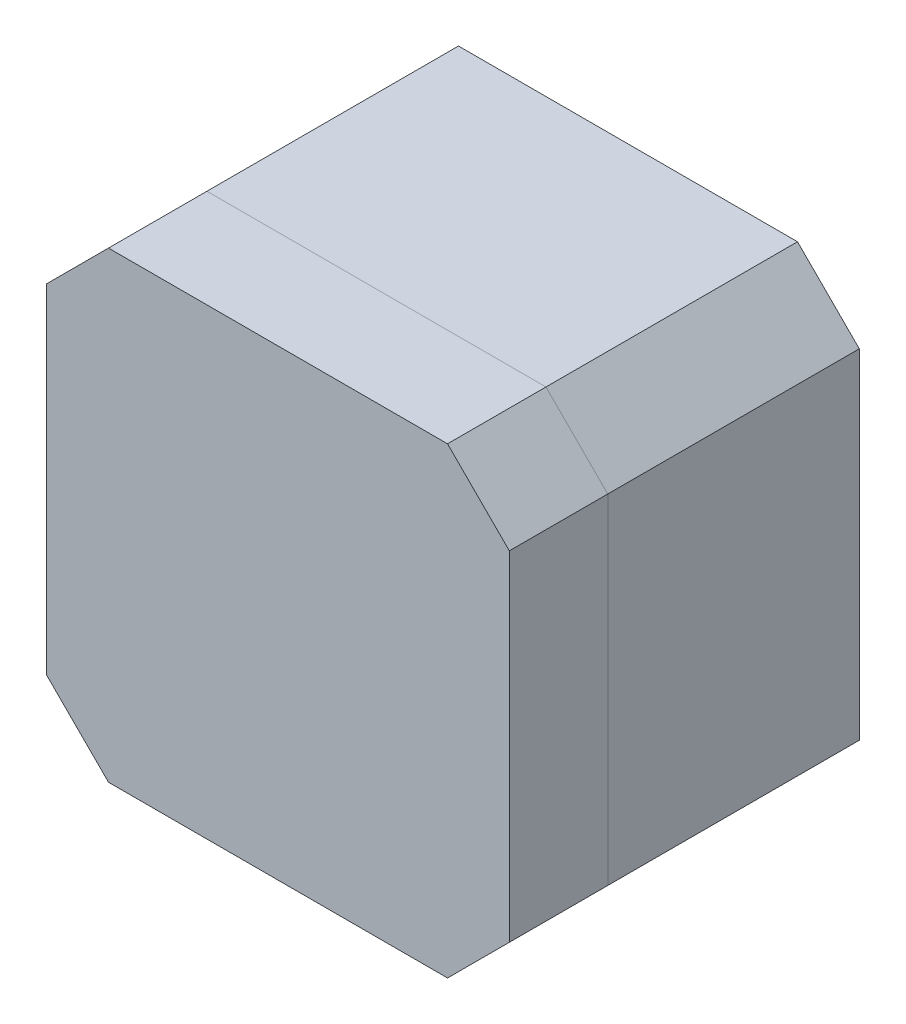
ISO-10303-21;
HEADER;
FILE_DESCRIPTION(('STEP AP214'),'2;1');
FILE_NAME('part.step','',(''),(''),'','','');
FILE_SCHEMA(('AUTOMOTIVE_DESIGN { 1 0 10303 214 1 1 1 1 }'));
ENDSEC;
DATA;
#1=APPLICATION_CONTEXT('core data for automotive mechanical design processes');
#2=APPLICATION_PROTOCOL_DEFINITION('international standard','automotive_design',2000,#1);
#3=PRODUCT_CONTEXT('',#1,'mechanical');
#4=PRODUCT('Part','Part','',(#3));
#5=PRODUCT_RELATED_PRODUCT_CATEGORY('part','',(#4));
#6=PRODUCT_DEFINITION_FORMATION('','',#4);
#7=PRODUCT_DEFINITION_CONTEXT('part definition',#1,'design');
#8=PRODUCT_DEFINITION('design','',#6,#7);
#9=PRODUCT_DEFINITION_SHAPE('','',#8);
#10=(LENGTH_UNIT() NAMED_UNIT(*) SI_UNIT(.MILLI.,.METRE.));
#11=(NAMED_UNIT(*) PLANE_ANGLE_UNIT() SI_UNIT($,.RADIAN.));
#12=(NAMED_UNIT(*) SI_UNIT($,.STERADIAN.) SOLID_ANGLE_UNIT());
#13=UNCERTAINTY_MEASURE_WITH_UNIT(LENGTH_MEASURE(1.E-05),#10,'distance_accuracy_value','');
#14=(GEOMETRIC_REPRESENTATION_CONTEXT(3) GLOBAL_UNCERTAINTY_ASSIGNED_CONTEXT((#13)) GLOBAL_UNIT_ASSIGNED_CONTEXT((#10,
#11,#12)) REPRESENTATION_CONTEXT('',''));
#15=CARTESIAN_POINT('',(0.,0.,0.));
#16=DIRECTION('',(0.,0.,1.));
#17=DIRECTION('',(1.,0.,0.));
#18=AXIS2_PLACEMENT_3D('',#15,#16,#17);
#19=CARTESIAN_POINT('',(-28.5136216956462,-42.5764234913279,57.));
#20=DIRECTION('',(0.,0.,1.));
#21=DIRECTION('',(1.,0.,0.));
#22=AXIS2_PLACEMENT_3D('',#19,#20,#21);
#23=PLANE('',#22);
#24=DIRECTION('',(0.707106781186549,-0.707106781186547,0.));
#25=VECTOR('',#24,1.);
#26=CARTESIAN_POINT('',(-44.0136216956461,-63.7264234913279,57.));
#27=LINE('',#26,#25);
#28=CARTESIAN_POINT('',(-49.6636216956461,-58.0764234913279,57.));
#29=VERTEX_POINT('',#28);
#30=CARTESIAN_POINT('',(-44.0136216956461,-63.7264234913279,57.));
#31=VERTEX_POINT('',#30);
#32=EDGE_CURVE('P0_E10',#29,#31,#27,.T.);
#33=ORIENTED_EDGE('',*,*,#32,.T.);
#34=DIRECTION('',(1.,0.,0.));
#35=VECTOR('',#34,1.);
#36=CARTESIAN_POINT('',(-13.0136216956461,-63.7264234913279,57.));
#37=LINE('',#36,#35);
#38=CARTESIAN_POINT('',(-13.0136216956461,-63.7264234913279,57.));
#39=VERTEX_POINT('',#38);
#40=EDGE_CURVE('P0_E141',#31,#39,#37,.T.);
#41=ORIENTED_EDGE('',*,*,#40,.T.);
#42=DIRECTION('',(0.707106781186546,0.707106781186549,0.));
#43=VECTOR('',#42,1.);
#44=CARTESIAN_POINT('',(-7.36362169564612,-58.0764234913279,57.));
#45=LINE('',#44,#43);
#46=CARTESIAN_POINT('',(-7.36362169564612,-58.0764234913279,57.));
#47=VERTEX_POINT('',#46);
#48=EDGE_CURVE('P0_E55',#39,#47,#45,.T.);
#49=ORIENTED_EDGE('',*,*,#48,.T.);
#50=DIRECTION('',(0.,1.,0.));
#51=VECTOR('',#50,1.);
#52=CARTESIAN_POINT('',(-7.36362169564617,-27.0764234913279,57.));
#53=LINE('',#52,#51);
#54=CARTESIAN_POINT('',(-7.36362169564617,-27.0764234913279,57.));
#55=VERTEX_POINT('',#54);
#56=EDGE_CURVE('P0_E128',#47,#55,#53,.T.);
#57=ORIENTED_EDGE('',*,*,#56,.T.);
#58=DIRECTION('',(-0.707106781186552,0.707106781186543,0.));
#59=VECTOR('',#58,1.);
#60=CARTESIAN_POINT('',(-13.0136216956462,-21.4264234913279,57.));
#61=LINE('',#60,#59);
#62=CARTESIAN_POINT('',(-13.0136216956462,-21.4264234913279,57.));
#63=VERTEX_POINT('',#62);
#64=EDGE_CURVE('P0_E97',#55,#63,#61,.T.);
#65=ORIENTED_EDGE('',*,*,#64,.T.);
#66=DIRECTION('',(-1.,0.,0.));
#67=VECTOR('',#66,1.);
#68=CARTESIAN_POINT('',(-44.0136216956462,-21.426423491328,57.));
#69=LINE('',#68,#67);
#70=CARTESIAN_POINT('',(-44.0136216956462,-21.426423491328,57.));
#71=VERTEX_POINT('',#70);
#72=EDGE_CURVE('P0_E79',#63,#71,#69,.T.);
#73=ORIENTED_EDGE('',*,*,#72,.T.);
#74=DIRECTION('',(-0.707106781186549,-0.707106781186547,0.));
#75=VECTOR('',#74,1.);
#76=CARTESIAN_POINT('',(-49.6636216956462,-27.0764234913279,57.));
#77=LINE('',#76,#75);
#78=CARTESIAN_POINT('',(-49.6636216956462,-27.0764234913279,57.));
#79=VERTEX_POINT('',#78);
#80=EDGE_CURVE('P0_E118',#71,#79,#77,.T.);
#81=ORIENTED_EDGE('',*,*,#80,.T.);
#82=DIRECTION('',(0.,-1.,0.));
#83=VECTOR('',#82,1.);
#84=CARTESIAN_POINT('',(-49.6636216956461,-58.0764234913279,57.));
#85=LINE('',#84,#83);
#86=EDGE_CURVE('P0_E159',#79,#29,#85,.T.);
#87=ORIENTED_EDGE('',*,*,#86,.T.);
#88=EDGE_LOOP('',(#33,#41,#49,#57,#65,#73,#81,#87));
#89=FACE_BOUND('',#88,.T.);
#90=ADVANCED_FACE('P0_F16',(#89),#23,.T.);
#91=CARTESIAN_POINT('',(-28.5136216956462,-42.5764234913279,48.));
#92=DIRECTION('',(0.,0.,1.));
#93=DIRECTION('',(1.,0.,0.));
#94=AXIS2_PLACEMENT_3D('',#91,#92,#93);
#95=PLANE('',#94);
#96=DIRECTION('',(-0.707106781186549,0.707106781186547,0.));
#97=VECTOR('',#96,1.);
#98=CARTESIAN_POINT('',(-44.0136216956462,-63.7264234913279,48.));
#99=LINE('',#98,#97);
#100=CARTESIAN_POINT('',(-44.0136216956462,-63.7264234913279,48.));
#101=VERTEX_POINT('',#100);
#102=CARTESIAN_POINT('',(-49.6636216956461,-58.0764234913279,48.));
#103=VERTEX_POINT('',#102);
#104=EDGE_CURVE('P0_E24',#101,#103,#99,.T.);
#105=ORIENTED_EDGE('',*,*,#104,.T.);
#106=DIRECTION('',(0.,1.,0.));
#107=VECTOR('',#106,1.);
#108=CARTESIAN_POINT('',(-49.6636216956461,-58.0764234913279,48.));
#109=LINE('',#108,#107);
#110=CARTESIAN_POINT('',(-49.6636216956462,-27.0764234913279,48.));
#111=VERTEX_POINT('',#110);
#112=EDGE_CURVE('P0_E151',#103,#111,#109,.T.);
#113=ORIENTED_EDGE('',*,*,#112,.T.);
#114=DIRECTION('',(0.707106781186549,0.707106781186547,0.));
#115=VECTOR('',#114,1.);
#116=CARTESIAN_POINT('',(-49.6636216956462,-27.0764234913279,48.));
#117=LINE('',#116,#115);
#118=CARTESIAN_POINT('',(-44.0136216956462,-21.426423491328,48.));
#119=VERTEX_POINT('',#118);
#120=EDGE_CURVE('P0_E109',#111,#119,#117,.T.);
#121=ORIENTED_EDGE('',*,*,#120,.T.);
#122=DIRECTION('',(1.,0.,0.));
#123=VECTOR('',#122,1.);
#124=CARTESIAN_POINT('',(-44.0136216956462,-21.426423491328,48.));
#125=LINE('',#124,#123);
#126=CARTESIAN_POINT('',(-13.0136216956462,-21.4264234913279,48.));
#127=VERTEX_POINT('',#126);
#128=EDGE_CURVE('P0_E101',#119,#127,#125,.T.);
#129=ORIENTED_EDGE('',*,*,#128,.T.);
#130=DIRECTION('',(0.707106781186552,-0.707106781186543,0.));
#131=VECTOR('',#130,1.);
#132=CARTESIAN_POINT('',(-13.0136216956462,-21.4264234913279,48.));
#133=LINE('',#132,#131);
#134=CARTESIAN_POINT('',(-7.36362169564617,-27.0764234913279,48.));
#135=VERTEX_POINT('',#134);
#136=EDGE_CURVE('P0_E86',#127,#135,#133,.T.);
#137=ORIENTED_EDGE('',*,*,#136,.T.);
#138=DIRECTION('',(0.,-1.,0.));
#139=VECTOR('',#138,1.);
#140=CARTESIAN_POINT('',(-7.36362169564617,-27.0764234913279,48.));
#141=LINE('',#140,#139);
#142=CARTESIAN_POINT('',(-7.36362169564612,-58.0764234913279,48.));
#143=VERTEX_POINT('',#142);
#144=EDGE_CURVE('P0_E124',#135,#143,#141,.T.);
#145=ORIENTED_EDGE('',*,*,#144,.T.);
#146=DIRECTION('',(-0.707106781186546,-0.707106781186549,0.));
#147=VECTOR('',#146,1.);
#148=CARTESIAN_POINT('',(-7.36362169564612,-58.0764234913279,48.));
#149=LINE('',#148,#147);
#150=CARTESIAN_POINT('',(-13.0136216956461,-63.7264234913279,48.));
#151=VERTEX_POINT('',#150);
#152=EDGE_CURVE('P0_E64',#143,#151,#149,.T.);
#153=ORIENTED_EDGE('',*,*,#152,.T.);
#154=DIRECTION('',(-1.,0.,0.));
#155=VECTOR('',#154,1.);
#156=CARTESIAN_POINT('',(-13.0136216956461,-63.7264234913279,48.));
#157=LINE('',#156,#155);
#158=EDGE_CURVE('P0_E137',#151,#101,#157,.T.);
#159=ORIENTED_EDGE('',*,*,#158,.T.);
#160=EDGE_LOOP('',(#105,#113,#121,#129,#137,#145,#153,#159));
#161=FACE_BOUND('',#160,.T.);
#162=ADVANCED_FACE('P0_F106',(#161),#95,.F.);
#163=CARTESIAN_POINT('',(-49.6636216956461,-58.0764234913279,48.));
#164=DIRECTION('',(-0.707106781186547,-0.707106781186549,0.));
#165=DIRECTION('',(0.707106781186549,-0.707106781186547,0.));
#166=AXIS2_PLACEMENT_3D('',#163,#164,#165);
#167=PLANE('',#166);
#168=ORIENTED_EDGE('',*,*,#104,.F.);
#169=DIRECTION('',(0.,0.,1.));
#170=VECTOR('',#169,1.);
#171=CARTESIAN_POINT('',(-44.0136216956462,-63.7264234913279,48.));
#172=LINE('',#171,#170);
#173=EDGE_CURVE('P0_E144',#101,#31,#172,.T.);
#174=ORIENTED_EDGE('',*,*,#173,.T.);
#175=ORIENTED_EDGE('',*,*,#32,.F.);
#176=DIRECTION('',(0.,0.,1.));
#177=VECTOR('',#176,1.);
#178=CARTESIAN_POINT('',(-49.6636216956461,-58.0764234913279,48.));
#179=LINE('',#178,#177);
#180=EDGE_CURVE('P0_E154',#103,#29,#179,.T.);
#181=ORIENTED_EDGE('',*,*,#180,.F.);
#182=EDGE_LOOP('',(#168,#174,#175,#181));
#183=FACE_BOUND('',#182,.T.);
#184=ADVANCED_FACE('P0_F155',(#183),#167,.T.);
#185=CARTESIAN_POINT('',(-44.0136216956462,-63.7264234913279,48.));
#186=DIRECTION('',(0.,-1.,0.));
#187=DIRECTION('',(1.,0.,0.));
#188=AXIS2_PLACEMENT_3D('',#185,#186,#187);
#189=PLANE('',#188);
#190=ORIENTED_EDGE('',*,*,#158,.F.);
#191=DIRECTION('',(0.,0.,1.));
#192=VECTOR('',#191,1.);
#193=CARTESIAN_POINT('',(-13.0136216956461,-63.7264234913279,48.));
#194=LINE('',#193,#192);
#195=EDGE_CURVE('P0_E133',#151,#39,#194,.T.);
#196=ORIENTED_EDGE('',*,*,#195,.T.);
#197=ORIENTED_EDGE('',*,*,#40,.F.);
#198=ORIENTED_EDGE('',*,*,#173,.F.);
#199=EDGE_LOOP('',(#190,#196,#197,#198));
#200=FACE_BOUND('',#199,.T.);
#201=ADVANCED_FACE('P0_F200',(#200),#189,.T.);
#202=CARTESIAN_POINT('',(-13.0136216956461,-63.7264234913279,48.));
#203=DIRECTION('',(0.707106781186549,-0.707106781186546,0.));
#204=DIRECTION('',(0.707106781186546,0.707106781186549,0.));
#205=AXIS2_PLACEMENT_3D('',#202,#203,#204);
#206=PLANE('',#205);
#207=ORIENTED_EDGE('',*,*,#152,.F.);
#208=DIRECTION('',(0.,0.,1.));
#209=VECTOR('',#208,1.);
#210=CARTESIAN_POINT('',(-7.36362169564612,-58.0764234913279,48.));
#211=LINE('',#210,#209);
#212=EDGE_CURVE('P0_E125',#143,#47,#211,.T.);
#213=ORIENTED_EDGE('',*,*,#212,.T.);
#214=ORIENTED_EDGE('',*,*,#48,.F.);
#215=ORIENTED_EDGE('',*,*,#195,.F.);
#216=EDGE_LOOP('',(#207,#213,#214,#215));
#217=FACE_BOUND('',#216,.T.);
#218=ADVANCED_FACE('P0_F205',(#217),#206,.T.);
#219=CARTESIAN_POINT('',(-7.36362169564612,-58.0764234913279,48.));
#220=DIRECTION('',(1.,0.,0.));
#221=DIRECTION('',(0.,1.,0.));
#222=AXIS2_PLACEMENT_3D('',#219,#220,#221);
#223=PLANE('',#222);
#224=ORIENTED_EDGE('',*,*,#144,.F.);
#225=DIRECTION('',(0.,0.,1.));
#226=VECTOR('',#225,1.);
#227=CARTESIAN_POINT('',(-7.36362169564617,-27.0764234913279,48.));
#228=LINE('',#227,#226);
#229=EDGE_CURVE('P0_E92',#135,#55,#228,.T.);
#230=ORIENTED_EDGE('',*,*,#229,.T.);
#231=ORIENTED_EDGE('',*,*,#56,.F.);
#232=ORIENTED_EDGE('',*,*,#212,.F.);
#233=EDGE_LOOP('',(#224,#230,#231,#232));
#234=FACE_BOUND('',#233,.T.);
#235=ADVANCED_FACE('P0_F209',(#234),#223,.T.);
#236=CARTESIAN_POINT('',(-7.36362169564617,-27.0764234913279,48.));
#237=DIRECTION('',(0.707106781186543,0.707106781186552,0.));
#238=DIRECTION('',(-0.707106781186552,0.707106781186543,0.));
#239=AXIS2_PLACEMENT_3D('',#236,#237,#238);
#240=PLANE('',#239);
#241=ORIENTED_EDGE('',*,*,#136,.F.);
#242=DIRECTION('',(0.,0.,1.));
#243=VECTOR('',#242,1.);
#244=CARTESIAN_POINT('',(-13.0136216956462,-21.4264234913279,48.));
#245=LINE('',#244,#243);
#246=EDGE_CURVE('P0_E90',#127,#63,#245,.T.);
#247=ORIENTED_EDGE('',*,*,#246,.T.);
#248=ORIENTED_EDGE('',*,*,#64,.F.);
#249=ORIENTED_EDGE('',*,*,#229,.F.);
#250=EDGE_LOOP('',(#241,#247,#248,#249));
#251=FACE_BOUND('',#250,.T.);
#252=ADVANCED_FACE('P0_F88',(#251),#240,.T.);
#253=CARTESIAN_POINT('',(-13.0136216956462,-21.4264234913279,48.));
#254=DIRECTION('',(0.,1.,0.));
#255=DIRECTION('',(-1.,0.,0.));
#256=AXIS2_PLACEMENT_3D('',#253,#254,#255);
#257=PLANE('',#256);
#258=ORIENTED_EDGE('',*,*,#128,.F.);
#259=DIRECTION('',(0.,0.,1.));
#260=VECTOR('',#259,1.);
#261=CARTESIAN_POINT('',(-44.0136216956462,-21.426423491328,48.));
#262=LINE('',#261,#260);
#263=EDGE_CURVE('P0_E111',#119,#71,#262,.T.);
#264=ORIENTED_EDGE('',*,*,#263,.T.);
#265=ORIENTED_EDGE('',*,*,#72,.F.);
#266=ORIENTED_EDGE('',*,*,#246,.F.);
#267=EDGE_LOOP('',(#258,#264,#265,#266));
#268=FACE_BOUND('',#267,.T.);
#269=ADVANCED_FACE('P0_F100',(#268),#257,.T.);
#270=CARTESIAN_POINT('',(-44.0136216956462,-21.426423491328,48.));
#271=DIRECTION('',(-0.707106781186547,0.707106781186549,0.));
#272=DIRECTION('',(-0.707106781186549,-0.707106781186547,0.));
#273=AXIS2_PLACEMENT_3D('',#270,#271,#272);
#274=PLANE('',#273);
#275=ORIENTED_EDGE('',*,*,#120,.F.);
#276=DIRECTION('',(0.,0.,1.));
#277=VECTOR('',#276,1.);
#278=CARTESIAN_POINT('',(-49.6636216956462,-27.0764234913279,48.));
#279=LINE('',#278,#277);
#280=EDGE_CURVE('P0_E164',#111,#79,#279,.T.);
#281=ORIENTED_EDGE('',*,*,#280,.T.);
#282=ORIENTED_EDGE('',*,*,#80,.F.);
#283=ORIENTED_EDGE('',*,*,#263,.F.);
#284=EDGE_LOOP('',(#275,#281,#282,#283));
#285=FACE_BOUND('',#284,.T.);
#286=ADVANCED_FACE('P0_F183',(#285),#274,.T.);
#287=CARTESIAN_POINT('',(-49.6636216956462,-27.0764234913279,48.));
#288=DIRECTION('',(-1.,0.,0.));
#289=DIRECTION('',(0.,-1.,0.));
#290=AXIS2_PLACEMENT_3D('',#287,#288,#289);
#291=PLANE('',#290);
#292=ORIENTED_EDGE('',*,*,#112,.F.);
#293=ORIENTED_EDGE('',*,*,#180,.T.);
#294=ORIENTED_EDGE('',*,*,#86,.F.);
#295=ORIENTED_EDGE('',*,*,#280,.F.);
#296=EDGE_LOOP('',(#292,#293,#294,#295));
#297=FACE_BOUND('',#296,.T.);
#298=ADVANCED_FACE('P0_F162',(#297),#291,.T.);
#299=CLOSED_SHELL('',(#90,#162,#184,#201,#218,#235,#252,#269,#286,#298));
#300=MANIFOLD_SOLID_BREP('P0_B1',#299);
#301=CARTESIAN_POINT('',(-28.5136216956462,-42.5764234913279,25.));
#302=DIRECTION('',(0.,0.,-1.));
#303=DIRECTION('',(1.,0.,0.));
#304=AXIS2_PLACEMENT_3D('',#301,#302,#303);
#305=PLANE('',#304);
#306=DIRECTION('',(0.70710678118655,-0.707106781186545,0.));
#307=VECTOR('',#306,1.);
#308=CARTESIAN_POINT('',(-7.3636216956462,-27.0764234913279,25.));
#309=LINE('',#308,#307);
#310=CARTESIAN_POINT('',(-13.0136216956462,-21.4264234913279,25.));
#311=VERTEX_POINT('',#310);
#312=CARTESIAN_POINT('',(-7.3636216956462,-27.0764234913279,25.));
#313=VERTEX_POINT('',#312);
#314=EDGE_CURVE('P1_E10',#311,#313,#309,.T.);
#315=ORIENTED_EDGE('',*,*,#314,.T.);
#316=DIRECTION('',(0.,-1.,0.));
#317=VECTOR('',#316,1.);
#318=CARTESIAN_POINT('',(-7.36362169564615,-58.0764234913278,25.));
#319=LINE('',#318,#317);
#320=CARTESIAN_POINT('',(-7.36362169564615,-58.0764234913279,25.));
#321=VERTEX_POINT('',#320);
#322=EDGE_CURVE('P1_E83',#313,#321,#319,.T.);
#323=ORIENTED_EDGE('',*,*,#322,.T.);
#324=DIRECTION('',(-0.707106781186546,-0.707106781186549,0.));
#325=VECTOR('',#324,1.);
#326=CARTESIAN_POINT('',(-13.0136216956461,-63.7264234913279,25.));
#327=LINE('',#326,#325);
#328=CARTESIAN_POINT('',(-13.0136216956461,-63.7264234913279,25.));
#329=VERTEX_POINT('',#328);
#330=EDGE_CURVE('P1_E87',#321,#329,#327,.T.);
#331=ORIENTED_EDGE('',*,*,#330,.T.);
#332=DIRECTION('',(-1.,0.,0.));
#333=VECTOR('',#332,1.);
#334=CARTESIAN_POINT('',(-44.0136216956462,-63.7264234913279,25.));
#335=LINE('',#334,#333);
#336=CARTESIAN_POINT('',(-44.0136216956462,-63.7264234913279,25.));
#337=VERTEX_POINT('',#336);
#338=EDGE_CURVE('P1_E194',#329,#337,#335,.T.);
#339=ORIENTED_EDGE('',*,*,#338,.T.);
#340=DIRECTION('',(-0.707106781186549,0.707106781186546,0.));
#341=VECTOR('',#340,1.);
#342=CARTESIAN_POINT('',(-44.0136216956462,-63.7264234913279,25.));
#343=LINE('',#342,#341);
#344=CARTESIAN_POINT('',(-49.6636216956462,-58.0764234913279,25.));
#345=VERTEX_POINT('',#344);
#346=EDGE_CURVE('P1_E183',#337,#345,#343,.T.);
#347=ORIENTED_EDGE('',*,*,#346,.T.);
#348=DIRECTION('',(0.,1.,0.));
#349=VECTOR('',#348,1.);
#350=CARTESIAN_POINT('',(-49.6636216956462,-42.576423491328,25.));
#351=LINE('',#350,#349);
#352=CARTESIAN_POINT('',(-49.6636216956462,-27.0764234913279,25.));
#353=VERTEX_POINT('',#352);
#354=EDGE_CURVE('P1_E172',#345,#353,#351,.T.);
#355=ORIENTED_EDGE('',*,*,#354,.T.);
#356=DIRECTION('',(0.707106781186547,0.707106781186548,0.));
#357=VECTOR('',#356,1.);
#358=CARTESIAN_POINT('',(-49.6636216956462,-27.0764234913279,25.));
#359=LINE('',#358,#357);
#360=CARTESIAN_POINT('',(-44.0136216956462,-21.426423491328,25.));
#361=VERTEX_POINT('',#360);
#362=EDGE_CURVE('P1_E163',#353,#361,#359,.T.);
#363=ORIENTED_EDGE('',*,*,#362,.T.);
#364=DIRECTION('',(1.,0.,0.));
#365=VECTOR('',#364,1.);
#366=CARTESIAN_POINT('',(-13.0136216956462,-21.4264234913279,25.));
#367=LINE('',#366,#365);
#368=EDGE_CURVE('P1_E128',#361,#311,#367,.T.);
#369=ORIENTED_EDGE('',*,*,#368,.T.);
#370=EDGE_LOOP('',(#315,#323,#331,#339,#347,#355,#363,#369));
#371=FACE_BOUND('',#370,.T.);
#372=CARTESIAN_POINT('',(-44.0136216956462,-27.0764234913279,25.));
#373=DIRECTION('',(0.,0.,1.));
#374=DIRECTION('',(1.,0.,0.));
#375=AXIS2_PLACEMENT_3D('',#372,#373,#374);
#376=CIRCLE('',#375,1.5);
#377=CARTESIAN_POINT('',(-45.5136216956462,-27.0764234913279,25.));
#378=VERTEX_POINT('',#377);
#379=EDGE_CURVE('P1_E145',#378,#378,#376,.T.);
#380=ORIENTED_EDGE('',*,*,#379,.T.);
#381=EDGE_LOOP('',(#380));
#382=FACE_BOUND('',#381,.T.);
#383=CARTESIAN_POINT('',(-13.0136216956461,-58.0764234913279,25.));
#384=DIRECTION('',(0.,0.,1.));
#385=DIRECTION('',(1.,0.,0.));
#386=AXIS2_PLACEMENT_3D('',#383,#384,#385);
#387=CIRCLE('',#386,1.5);
#388=CARTESIAN_POINT('',(-14.5136216956461,-58.0764234913279,25.));
#389=VERTEX_POINT('',#388);
#390=EDGE_CURVE('P1_E139',#389,#389,#387,.T.);
#391=ORIENTED_EDGE('',*,*,#390,.T.);
#392=EDGE_LOOP('',(#391));
#393=FACE_BOUND('',#392,.T.);
#394=CARTESIAN_POINT('',(-44.0136216956462,-58.0764234913279,25.));
#395=DIRECTION('',(0.,0.,1.));
#396=DIRECTION('',(1.,0.,0.));
#397=AXIS2_PLACEMENT_3D('',#394,#395,#396);
#398=CIRCLE('',#397,1.5);
#399=CARTESIAN_POINT('',(-45.5136216956462,-58.0764234913279,25.));
#400=VERTEX_POINT('',#399);
#401=EDGE_CURVE('P1_E134',#400,#400,#398,.T.);
#402=ORIENTED_EDGE('',*,*,#401,.T.);
#403=EDGE_LOOP('',(#402));
#404=FACE_BOUND('',#403,.T.);
#405=CARTESIAN_POINT('',(-13.0136216956462,-27.0764234913279,25.));
#406=DIRECTION('',(0.,0.,1.));
#407=DIRECTION('',(1.,0.,0.));
#408=AXIS2_PLACEMENT_3D('',#405,#406,#407);
#409=CIRCLE('',#408,1.5);
#410=CARTESIAN_POINT('',(-14.5136216956462,-27.0764234913279,25.));
#411=VERTEX_POINT('',#410);
#412=EDGE_CURVE('P1_E135',#411,#411,#409,.T.);
#413=ORIENTED_EDGE('',*,*,#412,.T.);
#414=EDGE_LOOP('',(#413));
#415=FACE_BOUND('',#414,.T.);
#416=CARTESIAN_POINT('',(-28.5136216956462,-42.5764234913279,25.));
#417=DIRECTION('',(0.,0.,1.));
#418=DIRECTION('',(-1.,0.,0.));
#419=AXIS2_PLACEMENT_3D('',#416,#417,#418);
#420=CIRCLE('',#419,11.);
#421=CARTESIAN_POINT('',(-17.5136216956462,-42.5764234913279,25.));
#422=VERTEX_POINT('',#421);
#423=EDGE_CURVE('P1_E236',#422,#422,#420,.T.);
#424=ORIENTED_EDGE('',*,*,#423,.T.);
#425=EDGE_LOOP('',(#424));
#426=FACE_BOUND('',#425,.T.);
#427=ADVANCED_FACE('P1_F16',(#371,#382,#393,#404,#415,#426),#305,.T.);
#428=CARTESIAN_POINT('',(-28.5136216956462,-42.5764234913279,48.));
#429=DIRECTION('',(0.,0.,-1.));
#430=DIRECTION('',(1.,0.,0.));
#431=AXIS2_PLACEMENT_3D('',#428,#429,#430);
#432=PLANE('',#431);
#433=DIRECTION('',(-0.70710678118655,0.707106781186545,0.));
#434=VECTOR('',#433,1.);
#435=CARTESIAN_POINT('',(-7.36362169564617,-27.0764234913279,48.));
#436=LINE('',#435,#434);
#437=CARTESIAN_POINT('',(-7.36362169564617,-27.0764234913279,48.));
#438=VERTEX_POINT('',#437);
#439=CARTESIAN_POINT('',(-13.0136216956462,-21.4264234913279,48.));
#440=VERTEX_POINT('',#439);
#441=EDGE_CURVE('P1_E25',#438,#440,#436,.T.);
#442=ORIENTED_EDGE('',*,*,#441,.T.);
#443=DIRECTION('',(-1.,0.,0.));
#444=VECTOR('',#443,1.);
#445=CARTESIAN_POINT('',(-13.0136216956462,-21.4264234913279,48.));
#446=LINE('',#445,#444);
#447=CARTESIAN_POINT('',(-44.0136216956462,-21.426423491328,48.));
#448=VERTEX_POINT('',#447);
#449=EDGE_CURVE('P1_E148',#440,#448,#446,.T.);
#450=ORIENTED_EDGE('',*,*,#449,.T.);
#451=DIRECTION('',(0.707106781186547,0.707106781186548,0.));
#452=VECTOR('',#451,1.);
#453=CARTESIAN_POINT('',(-49.6636216956462,-27.0764234913279,48.));
#454=LINE('',#453,#452);
#455=CARTESIAN_POINT('',(-49.6636216956462,-27.0764234913279,48.));
#456=VERTEX_POINT('',#455);
#457=EDGE_CURVE('P1_E159',#456,#448,#454,.T.);
#458=ORIENTED_EDGE('',*,*,#457,.F.);
#459=DIRECTION('',(0.,-1.,0.));
#460=VECTOR('',#459,1.);
#461=CARTESIAN_POINT('',(-49.6636216956462,-42.576423491328,48.));
#462=LINE('',#461,#460);
#463=CARTESIAN_POINT('',(-49.6636216956461,-58.0764234913279,48.));
#464=VERTEX_POINT('',#463);
#465=EDGE_CURVE('P1_E168',#456,#464,#462,.T.);
#466=ORIENTED_EDGE('',*,*,#465,.T.);
#467=DIRECTION('',(-0.707106781186549,0.707106781186546,0.));
#468=VECTOR('',#467,1.);
#469=CARTESIAN_POINT('',(-44.0136216956462,-63.7264234913279,48.));
#470=LINE('',#469,#468);
#471=CARTESIAN_POINT('',(-44.0136216956462,-63.7264234913279,48.));
#472=VERTEX_POINT('',#471);
#473=EDGE_CURVE('P1_E180',#472,#464,#470,.T.);
#474=ORIENTED_EDGE('',*,*,#473,.F.);
#475=DIRECTION('',(1.,0.,0.));
#476=VECTOR('',#475,1.);
#477=CARTESIAN_POINT('',(-44.0136216956462,-63.7264234913279,48.));
#478=LINE('',#477,#476);
#479=CARTESIAN_POINT('',(-13.0136216956461,-63.7264234913279,48.));
#480=VERTEX_POINT('',#479);
#481=EDGE_CURVE('P1_E190',#472,#480,#478,.T.);
#482=ORIENTED_EDGE('',*,*,#481,.T.);
#483=DIRECTION('',(0.707106781186546,0.707106781186549,0.));
#484=VECTOR('',#483,1.);
#485=CARTESIAN_POINT('',(-13.0136216956461,-63.7264234913279,48.));
#486=LINE('',#485,#484);
#487=CARTESIAN_POINT('',(-7.36362169564612,-58.0764234913279,48.));
#488=VERTEX_POINT('',#487);
#489=EDGE_CURVE('P1_E108',#480,#488,#486,.T.);
#490=ORIENTED_EDGE('',*,*,#489,.T.);
#491=DIRECTION('',(0.,1.,0.));
#492=VECTOR('',#491,1.);
#493=CARTESIAN_POINT('',(-7.36362169564612,-58.0764234913278,48.));
#494=LINE('',#493,#492);
#495=EDGE_CURVE('P1_E93',#488,#438,#494,.T.);
#496=ORIENTED_EDGE('',*,*,#495,.T.);
#497=EDGE_LOOP('',(#442,#450,#458,#466,#474,#482,#490,#496));
#498=FACE_BOUND('',#497,.T.);
#499=ADVANCED_FACE('P1_F270',(#498),#432,.F.);
#500=CARTESIAN_POINT('',(-13.0136216956462,-21.4264234913279,48.));
#501=DIRECTION('',(0.707106781186545,0.70710678118655,0.));
#502=DIRECTION('',(0.70710678118655,-0.707106781186545,0.));
#503=AXIS2_PLACEMENT_3D('',#500,#501,#502);
#504=PLANE('',#503);
#505=ORIENTED_EDGE('',*,*,#441,.F.);
#506=DIRECTION('',(0.,0.,-1.));
#507=VECTOR('',#506,1.);
#508=CARTESIAN_POINT('',(-7.36362169564617,-27.0764234913279,48.));
#509=LINE('',#508,#507);
#510=EDGE_CURVE('P1_E92',#438,#313,#509,.T.);
#511=ORIENTED_EDGE('',*,*,#510,.T.);
#512=ORIENTED_EDGE('',*,*,#314,.F.);
#513=DIRECTION('',(0.,0.,-1.));
#514=VECTOR('',#513,1.);
#515=CARTESIAN_POINT('',(-13.0136216956462,-21.4264234913279,48.));
#516=LINE('',#515,#514);
#517=EDGE_CURVE('P1_E151',#440,#311,#516,.T.);
#518=ORIENTED_EDGE('',*,*,#517,.F.);
#519=EDGE_LOOP('',(#505,#511,#512,#518));
#520=FACE_BOUND('',#519,.T.);
#521=ADVANCED_FACE('P1_F274',(#520),#504,.T.);
#522=CARTESIAN_POINT('',(-7.36362169564617,-27.0764234913279,48.));
#523=DIRECTION('',(1.,0.,0.));
#524=DIRECTION('',(0.,-1.,0.));
#525=AXIS2_PLACEMENT_3D('',#522,#523,#524);
#526=PLANE('',#525);
#527=ORIENTED_EDGE('',*,*,#495,.F.);
#528=DIRECTION('',(0.,0.,-1.));
#529=VECTOR('',#528,1.);
#530=CARTESIAN_POINT('',(-7.36362169564612,-58.0764234913279,48.));
#531=LINE('',#530,#529);
#532=EDGE_CURVE('P1_E96',#488,#321,#531,.T.);
#533=ORIENTED_EDGE('',*,*,#532,.T.);
#534=ORIENTED_EDGE('',*,*,#322,.F.);
#535=ORIENTED_EDGE('',*,*,#510,.F.);
#536=EDGE_LOOP('',(#527,#533,#534,#535));
#537=FACE_BOUND('',#536,.T.);
#538=ADVANCED_FACE('P1_F97',(#537),#526,.T.);
#539=CARTESIAN_POINT('',(-7.36362169564612,-58.0764234913279,48.));
#540=DIRECTION('',(0.707106781186549,-0.707106781186546,0.));
#541=DIRECTION('',(-0.707106781186546,-0.707106781186549,0.));
#542=AXIS2_PLACEMENT_3D('',#539,#540,#541);
#543=PLANE('',#542);
#544=ORIENTED_EDGE('',*,*,#489,.F.);
#545=DIRECTION('',(0.,0.,-1.));
#546=VECTOR('',#545,1.);
#547=CARTESIAN_POINT('',(-13.0136216956461,-63.7264234913279,48.));
#548=LINE('',#547,#546);
#549=EDGE_CURVE('P1_E105',#480,#329,#548,.T.);
#550=ORIENTED_EDGE('',*,*,#549,.T.);
#551=ORIENTED_EDGE('',*,*,#330,.F.);
#552=ORIENTED_EDGE('',*,*,#532,.F.);
#553=EDGE_LOOP('',(#544,#550,#551,#552));
#554=FACE_BOUND('',#553,.T.);
#555=ADVANCED_FACE('P1_F103',(#554),#543,.T.);
#556=CARTESIAN_POINT('',(-13.0136216956461,-63.7264234913279,48.));
#557=DIRECTION('',(0.,-1.,0.));
#558=DIRECTION('',(-1.,0.,0.));
#559=AXIS2_PLACEMENT_3D('',#556,#557,#558);
#560=PLANE('',#559);
#561=ORIENTED_EDGE('',*,*,#481,.F.);
#562=DIRECTION('',(0.,0.,-1.));
#563=VECTOR('',#562,1.);
#564=CARTESIAN_POINT('',(-44.0136216956462,-63.7264234913279,48.));
#565=LINE('',#564,#563);
#566=EDGE_CURVE('P1_E186',#472,#337,#565,.T.);
#567=ORIENTED_EDGE('',*,*,#566,.T.);
#568=ORIENTED_EDGE('',*,*,#338,.F.);
#569=ORIENTED_EDGE('',*,*,#549,.F.);
#570=EDGE_LOOP('',(#561,#567,#568,#569));
#571=FACE_BOUND('',#570,.T.);
#572=ADVANCED_FACE('P1_F280',(#571),#560,.T.);
#573=CARTESIAN_POINT('',(-44.0136216956462,-63.7264234913279,48.));
#574=DIRECTION('',(-0.707106781186546,-0.707106781186549,0.));
#575=DIRECTION('',(-0.707106781186549,0.707106781186546,0.));
#576=AXIS2_PLACEMENT_3D('',#573,#574,#575);
#577=PLANE('',#576);
#578=ORIENTED_EDGE('',*,*,#473,.T.);
#579=DIRECTION('',(0.,0.,-1.));
#580=VECTOR('',#579,1.);
#581=CARTESIAN_POINT('',(-49.6636216956461,-58.0764234913279,48.));
#582=LINE('',#581,#580);
#583=EDGE_CURVE('P1_E176',#464,#345,#582,.T.);
#584=ORIENTED_EDGE('',*,*,#583,.T.);
#585=ORIENTED_EDGE('',*,*,#346,.F.);
#586=ORIENTED_EDGE('',*,*,#566,.F.);
#587=EDGE_LOOP('',(#578,#584,#585,#586));
#588=FACE_BOUND('',#587,.T.);
#589=ADVANCED_FACE('P1_F283',(#588),#577,.T.);
#590=CARTESIAN_POINT('',(-49.6636216956461,-58.0764234913279,48.));
#591=DIRECTION('',(-1.,0.,0.));
#592=DIRECTION('',(0.,1.,0.));
#593=AXIS2_PLACEMENT_3D('',#590,#591,#592);
#594=PLANE('',#593);
#595=ORIENTED_EDGE('',*,*,#465,.F.);
#596=DIRECTION('',(0.,0.,-1.));
#597=VECTOR('',#596,1.);
#598=CARTESIAN_POINT('',(-49.6636216956462,-27.0764234913279,48.));
#599=LINE('',#598,#597);
#600=EDGE_CURVE('P1_E164',#456,#353,#599,.T.);
#601=ORIENTED_EDGE('',*,*,#600,.T.);
#602=ORIENTED_EDGE('',*,*,#354,.F.);
#603=ORIENTED_EDGE('',*,*,#583,.F.);
#604=EDGE_LOOP('',(#595,#601,#602,#603));
#605=FACE_BOUND('',#604,.T.);
#606=ADVANCED_FACE('P1_F289',(#605),#594,.T.);
#607=CARTESIAN_POINT('',(-49.6636216956462,-27.0764234913279,48.));
#608=DIRECTION('',(-0.707106781186548,0.707106781186547,0.));
#609=DIRECTION('',(0.707106781186547,0.707106781186548,0.));
#610=AXIS2_PLACEMENT_3D('',#607,#608,#609);
#611=PLANE('',#610);
#612=ORIENTED_EDGE('',*,*,#457,.T.);
#613=DIRECTION('',(0.,0.,-1.));
#614=VECTOR('',#613,1.);
#615=CARTESIAN_POINT('',(-44.0136216956462,-21.426423491328,48.));
#616=LINE('',#615,#614);
#617=EDGE_CURVE('P1_E155',#448,#361,#616,.T.);
#618=ORIENTED_EDGE('',*,*,#617,.T.);
#619=ORIENTED_EDGE('',*,*,#362,.F.);
#620=ORIENTED_EDGE('',*,*,#600,.F.);
#621=EDGE_LOOP('',(#612,#618,#619,#620));
#622=FACE_BOUND('',#621,.T.);
#623=ADVANCED_FACE('P1_F285',(#622),#611,.T.);
#624=CARTESIAN_POINT('',(-44.0136216956462,-21.426423491328,48.));
#625=DIRECTION('',(0.,1.,0.));
#626=DIRECTION('',(1.,0.,0.));
#627=AXIS2_PLACEMENT_3D('',#624,#625,#626);
#628=PLANE('',#627);
#629=ORIENTED_EDGE('',*,*,#449,.F.);
#630=ORIENTED_EDGE('',*,*,#517,.T.);
#631=ORIENTED_EDGE('',*,*,#368,.F.);
#632=ORIENTED_EDGE('',*,*,#617,.F.);
#633=EDGE_LOOP('',(#629,#630,#631,#632));
#634=FACE_BOUND('',#633,.T.);
#635=ADVANCED_FACE('P1_F288',(#634),#628,.T.);
#636=CARTESIAN_POINT('',(-44.0136216956462,-27.0764234913279,29.5));
#637=DIRECTION('',(0.,0.,-1.));
#638=DIRECTION('',(-1.,0.,0.));
#639=AXIS2_PLACEMENT_3D('',#636,#637,#638);
#640=PLANE('',#639);
#641=CARTESIAN_POINT('',(-44.0136216956462,-27.0764234913279,29.5));
#642=DIRECTION('',(0.,0.,1.));
#643=DIRECTION('',(1.,0.,0.));
#644=AXIS2_PLACEMENT_3D('',#641,#642,#643);
#645=CIRCLE('',#644,1.5);
#646=CARTESIAN_POINT('',(-45.5136216956462,-27.0764234913279,29.5));
#647=VERTEX_POINT('',#646);
#648=EDGE_CURVE('P1_E142',#647,#647,#645,.T.);
#649=ORIENTED_EDGE('',*,*,#648,.F.);
#650=EDGE_LOOP('',(#649));
#651=FACE_BOUND('',#650,.T.);
#652=ADVANCED_FACE('P1_F293',(#651),#640,.T.);
#653=CARTESIAN_POINT('',(-44.0136216956462,-27.0764234913279,25.));
#654=DIRECTION('',(0.,0.,-1.));
#655=DIRECTION('',(1.,0.,0.));
#656=AXIS2_PLACEMENT_3D('',#653,#654,#655);
#657=CYLINDRICAL_SURFACE('',#656,1.5);
#658=ORIENTED_EDGE('',*,*,#379,.F.);
#659=EDGE_LOOP('',(#658));
#660=FACE_BOUND('',#659,.T.);
#661=ORIENTED_EDGE('',*,*,#648,.T.);
#662=EDGE_LOOP('',(#661));
#663=FACE_BOUND('',#662,.T.);
#664=ADVANCED_FACE('P1_F297',(#660,#663),#657,.F.);
#665=CARTESIAN_POINT('',(-13.0136216956461,-58.0764234913279,29.5));
#666=DIRECTION('',(0.,0.,-1.));
#667=DIRECTION('',(-1.,0.,0.));
#668=AXIS2_PLACEMENT_3D('',#665,#666,#667);
#669=PLANE('',#668);
#670=CARTESIAN_POINT('',(-13.0136216956461,-58.0764234913279,29.5));
#671=DIRECTION('',(0.,0.,1.));
#672=DIRECTION('',(1.,0.,0.));
#673=AXIS2_PLACEMENT_3D('',#670,#671,#672);
#674=CIRCLE('',#673,1.5);
#675=CARTESIAN_POINT('',(-14.5136216956461,-58.0764234913279,29.5));
#676=VERTEX_POINT('',#675);
#677=EDGE_CURVE('P1_E138',#676,#676,#674,.T.);
#678=ORIENTED_EDGE('',*,*,#677,.F.);
#679=EDGE_LOOP('',(#678));
#680=FACE_BOUND('',#679,.T.);
#681=ADVANCED_FACE('P1_F301',(#680),#669,.T.);
#682=CARTESIAN_POINT('',(-13.0136216956461,-58.0764234913279,25.));
#683=DIRECTION('',(0.,0.,-1.));
#684=DIRECTION('',(1.,0.,0.));
#685=AXIS2_PLACEMENT_3D('',#682,#683,#684);
#686=CYLINDRICAL_SURFACE('',#685,1.5);
#687=ORIENTED_EDGE('',*,*,#390,.F.);
#688=EDGE_LOOP('',(#687));
#689=FACE_BOUND('',#688,.T.);
#690=ORIENTED_EDGE('',*,*,#677,.T.);
#691=EDGE_LOOP('',(#690));
#692=FACE_BOUND('',#691,.T.);
#693=ADVANCED_FACE('P1_F308',(#689,#692),#686,.F.);
#694=CARTESIAN_POINT('',(-44.0136216956462,-58.0764234913279,29.5));
#695=DIRECTION('',(0.,0.,-1.));
#696=DIRECTION('',(-1.,0.,0.));
#697=AXIS2_PLACEMENT_3D('',#694,#695,#696);
#698=PLANE('',#697);
#699=CARTESIAN_POINT('',(-44.0136216956462,-58.0764234913279,29.5));
#700=DIRECTION('',(0.,0.,1.));
#701=DIRECTION('',(1.,0.,0.));
#702=AXIS2_PLACEMENT_3D('',#699,#700,#701);
#703=CIRCLE('',#702,1.5);
#704=CARTESIAN_POINT('',(-45.5136216956462,-58.0764234913279,29.5));
#705=VERTEX_POINT('',#704);
#706=EDGE_CURVE('P1_E130',#705,#705,#703,.T.);
#707=ORIENTED_EDGE('',*,*,#706,.F.);
#708=EDGE_LOOP('',(#707));
#709=FACE_BOUND('',#708,.T.);
#710=ADVANCED_FACE('P1_F312',(#709),#698,.T.);
#711=CARTESIAN_POINT('',(-44.0136216956462,-58.0764234913279,25.));
#712=DIRECTION('',(0.,0.,-1.));
#713=DIRECTION('',(1.,0.,0.));
#714=AXIS2_PLACEMENT_3D('',#711,#712,#713);
#715=CYLINDRICAL_SURFACE('',#714,1.5);
#716=ORIENTED_EDGE('',*,*,#401,.F.);
#717=EDGE_LOOP('',(#716));
#718=FACE_BOUND('',#717,.T.);
#719=ORIENTED_EDGE('',*,*,#706,.T.);
#720=EDGE_LOOP('',(#719));
#721=FACE_BOUND('',#720,.T.);
#722=ADVANCED_FACE('P1_F316',(#718,#721),#715,.F.);
#723=CARTESIAN_POINT('',(-13.0136216956462,-27.0764234913279,29.5));
#724=DIRECTION('',(0.,0.,-1.));
#725=DIRECTION('',(-1.,0.,0.));
#726=AXIS2_PLACEMENT_3D('',#723,#724,#725);
#727=PLANE('',#726);
#728=CARTESIAN_POINT('',(-13.0136216956462,-27.0764234913279,29.5));
#729=DIRECTION('',(0.,0.,1.));
#730=DIRECTION('',(1.,0.,0.));
#731=AXIS2_PLACEMENT_3D('',#728,#729,#730);
#732=CIRCLE('',#731,1.5);
#733=CARTESIAN_POINT('',(-14.5136216956462,-27.0764234913279,29.5));
#734=VERTEX_POINT('',#733);
#735=EDGE_CURVE('P1_E232',#734,#734,#732,.T.);
#736=ORIENTED_EDGE('',*,*,#735,.F.);
#737=EDGE_LOOP('',(#736));
#738=FACE_BOUND('',#737,.T.);
#739=ADVANCED_FACE('P1_F264',(#738),#727,.T.);
#740=CARTESIAN_POINT('',(-13.0136216956462,-27.0764234913279,25.));
#741=DIRECTION('',(0.,0.,-1.));
#742=DIRECTION('',(1.,0.,0.));
#743=AXIS2_PLACEMENT_3D('',#740,#741,#742);
#744=CYLINDRICAL_SURFACE('',#743,1.5);
#745=ORIENTED_EDGE('',*,*,#412,.F.);
#746=EDGE_LOOP('',(#745));
#747=FACE_BOUND('',#746,.T.);
#748=ORIENTED_EDGE('',*,*,#735,.T.);
#749=EDGE_LOOP('',(#748));
#750=FACE_BOUND('',#749,.T.);
#751=ADVANCED_FACE('P1_F255',(#747,#750),#744,.F.);
#752=CARTESIAN_POINT('',(-28.5136216956462,-42.5764234913279,25.));
#753=DIRECTION('',(0.,0.,1.));
#754=DIRECTION('',(-1.,0.,0.));
#755=AXIS2_PLACEMENT_3D('',#752,#753,#754);
#756=CYLINDRICAL_SURFACE('',#755,11.);
#757=ORIENTED_EDGE('',*,*,#423,.F.);
#758=EDGE_LOOP('',(#757));
#759=FACE_BOUND('',#758,.T.);
#760=CARTESIAN_POINT('',(-28.5136216956462,-42.5764234913279,23.));
#761=DIRECTION('',(0.,0.,-1.));
#762=DIRECTION('',(-1.,0.,0.));
#763=AXIS2_PLACEMENT_3D('',#760,#761,#762);
#764=CIRCLE('',#763,11.);
#765=CARTESIAN_POINT('',(-17.5136216956462,-42.5764234913279,23.));
#766=VERTEX_POINT('',#765);
#767=EDGE_CURVE('P1_E241',#766,#766,#764,.T.);
#768=ORIENTED_EDGE('',*,*,#767,.F.);
#769=EDGE_LOOP('',(#768));
#770=FACE_BOUND('',#769,.T.);
#771=ADVANCED_FACE('P1_F253',(#759,#770),#756,.T.);
#772=CARTESIAN_POINT('',(-28.5136216956462,-42.5764234913279,23.));
#773=DIRECTION('',(0.,0.,-1.));
#774=DIRECTION('',(1.,0.,0.));
#775=AXIS2_PLACEMENT_3D('',#772,#773,#774);
#776=PLANE('',#775);
#777=ORIENTED_EDGE('',*,*,#767,.T.);
#778=EDGE_LOOP('',(#777));
#779=FACE_BOUND('',#778,.T.);
#780=ADVANCED_FACE('P1_F249',(#779),#776,.T.);
#781=CLOSED_SHELL('',(#427,#499,#521,#538,#555,#572,#589,#606,#623,#635,#652,#664,#681,#693,
#710,#722,#739,#751,#771,#780));
#782=MANIFOLD_SOLID_BREP('P1_B1',#781);
#783=ADVANCED_BREP_SHAPE_REPRESENTATION('',(#18,#300,#782),#14);
#784=SHAPE_DEFINITION_REPRESENTATION(#9,#783);
ENDSEC;
END-ISO-10303-21;
